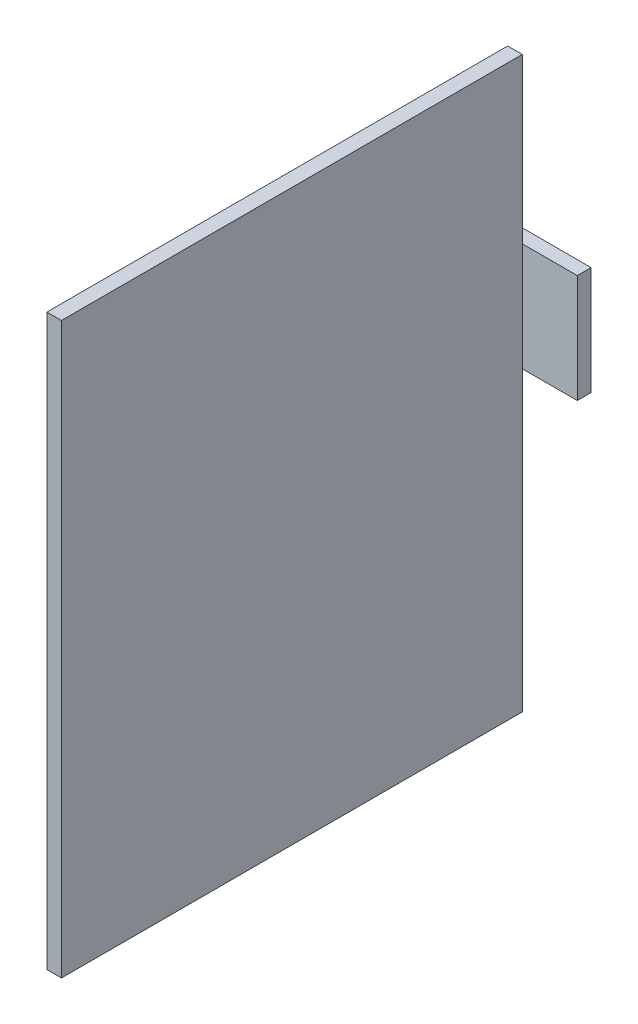
ISO-10303-21;
HEADER;
FILE_DESCRIPTION(('STEP AP214'),'2;1');
FILE_NAME('part.step','',(''),(''),'','','');
FILE_SCHEMA(('AUTOMOTIVE_DESIGN { 1 0 10303 214 1 1 1 1 }'));
ENDSEC;
DATA;
#1=APPLICATION_CONTEXT('core data for automotive mechanical design processes');
#2=APPLICATION_PROTOCOL_DEFINITION('international standard','automotive_design',2000,#1);
#3=PRODUCT_CONTEXT('',#1,'mechanical');
#4=PRODUCT('Part','Part','',(#3));
#5=PRODUCT_RELATED_PRODUCT_CATEGORY('part','',(#4));
#6=PRODUCT_DEFINITION_FORMATION('','',#4);
#7=PRODUCT_DEFINITION_CONTEXT('part definition',#1,'design');
#8=PRODUCT_DEFINITION('design','',#6,#7);
#9=PRODUCT_DEFINITION_SHAPE('','',#8);
#10=(LENGTH_UNIT() NAMED_UNIT(*) SI_UNIT(.MILLI.,.METRE.));
#11=(NAMED_UNIT(*) PLANE_ANGLE_UNIT() SI_UNIT($,.RADIAN.));
#12=(NAMED_UNIT(*) SI_UNIT($,.STERADIAN.) SOLID_ANGLE_UNIT());
#13=UNCERTAINTY_MEASURE_WITH_UNIT(LENGTH_MEASURE(1.E-05),#10,'distance_accuracy_value','');
#14=(GEOMETRIC_REPRESENTATION_CONTEXT(3) GLOBAL_UNCERTAINTY_ASSIGNED_CONTEXT((#13)) GLOBAL_UNIT_ASSIGNED_CONTEXT((#10,
#11,#12)) REPRESENTATION_CONTEXT('',''));
#15=CARTESIAN_POINT('',(0.,0.,0.));
#16=DIRECTION('',(0.,0.,1.));
#17=DIRECTION('',(1.,0.,0.));
#18=AXIS2_PLACEMENT_3D('',#15,#16,#17);
#19=CARTESIAN_POINT('',(0.,0.,3.));
#20=DIRECTION('',(0.,0.,1.));
#21=DIRECTION('',(1.,0.,0.));
#22=AXIS2_PLACEMENT_3D('',#19,#20,#21);
#23=PLANE('',#22);
#24=DIRECTION('',(0.,1.,0.));
#25=VECTOR('',#24,1.);
#26=CARTESIAN_POINT('',(-21.822491273943,47.7619782726975,3.));
#27=LINE('',#26,#25);
#28=CARTESIAN_POINT('',(-21.822491273943,-11.320502397344,3.));
#29=VERTEX_POINT('',#28);
#30=CARTESIAN_POINT('',(-21.822491273943,12.1690218367093,3.));
#31=VERTEX_POINT('',#30);
#32=EDGE_CURVE('E189',#29,#31,#27,.T.);
#33=ORIENTED_EDGE('',*,*,#32,.F.);
#34=DIRECTION('',(1.,0.,0.));
#35=VECTOR('',#34,1.);
#36=CARTESIAN_POINT('',(-33.5890871212518,-11.320502397344,3.));
#37=LINE('',#36,#35);
#38=CARTESIAN_POINT('',(-9.88669555588512,-11.320502397344,3.));
#39=VERTEX_POINT('',#38);
#40=EDGE_CURVE('E163',#29,#39,#37,.T.);
#41=ORIENTED_EDGE('',*,*,#40,.T.);
#42=DIRECTION('',(0.,1.,0.));
#43=VECTOR('',#42,1.);
#44=CARTESIAN_POINT('',(-9.88669555588512,12.1690218367093,3.));
#45=LINE('',#44,#43);
#46=CARTESIAN_POINT('',(-9.88669555588512,12.1690218367093,3.));
#47=VERTEX_POINT('',#46);
#48=EDGE_CURVE('E167',#39,#47,#45,.T.);
#49=ORIENTED_EDGE('',*,*,#48,.T.);
#50=DIRECTION('',(-1.,0.,0.));
#51=VECTOR('',#50,1.);
#52=CARTESIAN_POINT('',(-33.5890871212518,12.1690218367093,3.));
#53=LINE('',#52,#51);
#54=EDGE_CURVE('E170',#47,#31,#53,.T.);
#55=ORIENTED_EDGE('',*,*,#54,.T.);
#56=EDGE_LOOP('',(#33,#41,#49,#55));
#57=FACE_BOUND('',#56,.T.);
#58=ADVANCED_FACE('F43',(#57),#23,.T.);
#59=CARTESIAN_POINT('',(-33.5890871212518,12.1690218367093,3.));
#60=DIRECTION('',(1.,0.,0.));
#61=DIRECTION('',(0.,0.,-1.));
#62=AXIS2_PLACEMENT_3D('',#59,#60,#61);
#63=PLANE('',#62);
#64=DIRECTION('',(0.,-1.,0.));
#65=VECTOR('',#64,1.);
#66=CARTESIAN_POINT('',(-33.5890871212518,12.1690218367093,0.));
#67=LINE('',#66,#65);
#68=CARTESIAN_POINT('',(-33.5890871212518,12.1690218367093,0.));
#69=VERTEX_POINT('',#68);
#70=CARTESIAN_POINT('',(-33.5890871212518,-11.320502397344,0.));
#71=VERTEX_POINT('',#70);
#72=EDGE_CURVE('E152',#69,#71,#67,.T.);
#73=ORIENTED_EDGE('',*,*,#72,.T.);
#74=DIRECTION('',(0.,0.,-1.));
#75=VECTOR('',#74,1.);
#76=CARTESIAN_POINT('',(-33.5890871212518,-11.320502397344,3.));
#77=LINE('',#76,#75);
#78=CARTESIAN_POINT('',(-33.5890871212518,-11.320502397344,3.));
#79=VERTEX_POINT('',#78);
#80=EDGE_CURVE('E186',#79,#71,#77,.T.);
#81=ORIENTED_EDGE('',*,*,#80,.F.);
#82=DIRECTION('',(0.,-1.,0.));
#83=VECTOR('',#82,1.);
#84=CARTESIAN_POINT('',(-33.5890871212518,12.1690218367093,3.));
#85=LINE('',#84,#83);
#86=CARTESIAN_POINT('',(-33.5890871212518,12.1690218367093,3.));
#87=VERTEX_POINT('',#86);
#88=EDGE_CURVE('E161',#87,#79,#85,.T.);
#89=ORIENTED_EDGE('',*,*,#88,.F.);
#90=DIRECTION('',(0.,0.,-1.));
#91=VECTOR('',#90,1.);
#92=CARTESIAN_POINT('',(-33.5890871212518,12.1690218367093,3.));
#93=LINE('',#92,#91);
#94=EDGE_CURVE('E172',#87,#69,#93,.T.);
#95=ORIENTED_EDGE('',*,*,#94,.T.);
#96=EDGE_LOOP('',(#73,#81,#89,#95));
#97=FACE_BOUND('',#96,.T.);
#98=ADVANCED_FACE('F201',(#97),#63,.F.);
#99=CARTESIAN_POINT('',(-33.5890871212518,-11.320502397344,3.));
#100=DIRECTION('',(0.,1.,0.));
#101=DIRECTION('',(0.,0.,1.));
#102=AXIS2_PLACEMENT_3D('',#99,#100,#101);
#103=PLANE('',#102);
#104=DIRECTION('',(1.,0.,0.));
#105=VECTOR('',#104,1.);
#106=CARTESIAN_POINT('',(-33.5890871212518,-11.320502397344,0.));
#107=LINE('',#106,#105);
#108=CARTESIAN_POINT('',(-9.88669555588512,-11.320502397344,0.));
#109=VERTEX_POINT('',#108);
#110=EDGE_CURVE('E155',#71,#109,#107,.T.);
#111=ORIENTED_EDGE('',*,*,#110,.T.);
#112=DIRECTION('',(0.,0.,-1.));
#113=VECTOR('',#112,1.);
#114=CARTESIAN_POINT('',(-9.88669555588512,-11.320502397344,3.));
#115=LINE('',#114,#113);
#116=EDGE_CURVE('E183',#39,#109,#115,.T.);
#117=ORIENTED_EDGE('',*,*,#116,.F.);
#118=ORIENTED_EDGE('',*,*,#40,.F.);
#119=CARTESIAN_POINT('',(-24.9880001857896,-11.320502397344,3.));
#120=VERTEX_POINT('',#119);
#121=EDGE_CURVE('E166',#120,#29,#37,.T.);
#122=ORIENTED_EDGE('',*,*,#121,.F.);
#123=DIRECTION('',(0.,0.,-1.));
#124=VECTOR('',#123,1.);
#125=CARTESIAN_POINT('',(-24.9880001857896,-11.320502397344,3.));
#126=LINE('',#125,#124);
#127=CARTESIAN_POINT('',(-24.9880001857896,-11.320502397344,24.0258536011348));
#128=VERTEX_POINT('',#127);
#129=EDGE_CURVE('E194',#128,#120,#126,.T.);
#130=ORIENTED_EDGE('',*,*,#129,.F.);
#131=CARTESIAN_POINT('',(-54.9880001857896,-11.320502397344,24.0258536011348));
#132=DIRECTION('',(0.,1.,0.));
#133=DIRECTION('',(0.,0.,1.));
#134=AXIS2_PLACEMENT_3D('',#131,#132,#133);
#135=CIRCLE('',#134,30.);
#136=EDGE_CURVE('E51',#128,#79,#135,.T.);
#137=ORIENTED_EDGE('',*,*,#136,.T.);
#138=ORIENTED_EDGE('',*,*,#80,.T.);
#139=EDGE_LOOP('',(#111,#117,#118,#122,#130,#137,#138));
#140=FACE_BOUND('',#139,.T.);
#141=ADVANCED_FACE('F197',(#140),#103,.F.);
#142=CARTESIAN_POINT('',(-9.88669555588512,12.1690218367093,3.));
#143=DIRECTION('',(-1.,0.,0.));
#144=DIRECTION('',(0.,0.,1.));
#145=AXIS2_PLACEMENT_3D('',#142,#143,#144);
#146=PLANE('',#145);
#147=DIRECTION('',(0.,1.,0.));
#148=VECTOR('',#147,1.);
#149=CARTESIAN_POINT('',(-9.88669555588512,12.1690218367093,0.));
#150=LINE('',#149,#148);
#151=CARTESIAN_POINT('',(-9.88669555588512,12.1690218367093,0.));
#152=VERTEX_POINT('',#151);
#153=EDGE_CURVE('E175',#109,#152,#150,.T.);
#154=ORIENTED_EDGE('',*,*,#153,.T.);
#155=DIRECTION('',(0.,0.,-1.));
#156=VECTOR('',#155,1.);
#157=CARTESIAN_POINT('',(-9.88669555588512,12.1690218367093,3.));
#158=LINE('',#157,#156);
#159=EDGE_CURVE('E180',#47,#152,#158,.T.);
#160=ORIENTED_EDGE('',*,*,#159,.F.);
#161=ORIENTED_EDGE('',*,*,#48,.F.);
#162=ORIENTED_EDGE('',*,*,#116,.T.);
#163=EDGE_LOOP('',(#154,#160,#161,#162));
#164=FACE_BOUND('',#163,.T.);
#165=ADVANCED_FACE('F221',(#164),#146,.F.);
#166=CARTESIAN_POINT('',(-33.5890871212518,12.1690218367093,3.));
#167=DIRECTION('',(0.,-1.,0.));
#168=DIRECTION('',(0.,0.,-1.));
#169=AXIS2_PLACEMENT_3D('',#166,#167,#168);
#170=PLANE('',#169);
#171=DIRECTION('',(-1.,0.,0.));
#172=VECTOR('',#171,1.);
#173=CARTESIAN_POINT('',(-33.5890871212518,12.1690218367093,0.));
#174=LINE('',#173,#172);
#175=EDGE_CURVE('E164',#152,#69,#174,.T.);
#176=ORIENTED_EDGE('',*,*,#175,.T.);
#177=ORIENTED_EDGE('',*,*,#94,.F.);
#178=CARTESIAN_POINT('',(-54.9880001857896,12.1690218367093,24.0258536011348));
#179=DIRECTION('',(0.,-1.,0.));
#180=DIRECTION('',(0.,0.,-1.));
#181=AXIS2_PLACEMENT_3D('',#178,#179,#180);
#182=CIRCLE('',#181,30.);
#183=CARTESIAN_POINT('',(-24.9880001857896,12.1690218367093,24.0258536011348));
#184=VERTEX_POINT('',#183);
#185=EDGE_CURVE('E11',#87,#184,#182,.T.);
#186=ORIENTED_EDGE('',*,*,#185,.T.);
#187=DIRECTION('',(0.,0.,1.));
#188=VECTOR('',#187,1.);
#189=CARTESIAN_POINT('',(-24.9880001857896,12.1690218367093,3.));
#190=LINE('',#189,#188);
#191=CARTESIAN_POINT('',(-24.9880001857896,12.1690218367093,3.));
#192=VERTEX_POINT('',#191);
#193=EDGE_CURVE('E57',#192,#184,#190,.T.);
#194=ORIENTED_EDGE('',*,*,#193,.F.);
#195=EDGE_CURVE('E169',#31,#192,#53,.T.);
#196=ORIENTED_EDGE('',*,*,#195,.F.);
#197=ORIENTED_EDGE('',*,*,#54,.F.);
#198=ORIENTED_EDGE('',*,*,#159,.T.);
#199=EDGE_LOOP('',(#176,#177,#186,#194,#196,#197,#198));
#200=FACE_BOUND('',#199,.T.);
#201=ADVANCED_FACE('F204',(#200),#170,.F.);
#202=CARTESIAN_POINT('',(0.,0.,0.));
#203=DIRECTION('',(0.,0.,1.));
#204=DIRECTION('',(1.,0.,0.));
#205=AXIS2_PLACEMENT_3D('',#202,#203,#204);
#206=PLANE('',#205);
#207=ORIENTED_EDGE('',*,*,#72,.F.);
#208=ORIENTED_EDGE('',*,*,#175,.F.);
#209=ORIENTED_EDGE('',*,*,#153,.F.);
#210=ORIENTED_EDGE('',*,*,#110,.F.);
#211=EDGE_LOOP('',(#207,#208,#209,#210));
#212=FACE_BOUND('',#211,.T.);
#213=ADVANCED_FACE('F225',(#212),#206,.F.);
#214=CARTESIAN_POINT('',(0.,0.,3.));
#215=DIRECTION('',(0.,0.,-1.));
#216=DIRECTION('',(-1.,0.,0.));
#217=AXIS2_PLACEMENT_3D('',#214,#215,#216);
#218=PLANE('',#217);
#219=DIRECTION('',(0.,-1.,0.));
#220=VECTOR('',#219,1.);
#221=CARTESIAN_POINT('',(-24.9880001857896,47.7619782726975,3.));
#222=LINE('',#221,#220);
#223=CARTESIAN_POINT('',(-24.9880001857896,-75.8060197025742,3.));
#224=VERTEX_POINT('',#223);
#225=EDGE_CURVE('E211',#120,#224,#222,.T.);
#226=ORIENTED_EDGE('',*,*,#225,.F.);
#227=ORIENTED_EDGE('',*,*,#121,.T.);
#228=CARTESIAN_POINT('',(-21.822491273943,-75.8060197025742,3.));
#229=VERTEX_POINT('',#228);
#230=EDGE_CURVE('E232',#229,#29,#27,.T.);
#231=ORIENTED_EDGE('',*,*,#230,.F.);
#232=DIRECTION('',(1.,0.,0.));
#233=VECTOR('',#232,1.);
#234=CARTESIAN_POINT('',(-21.822491273943,-75.8060197025742,3.));
#235=LINE('',#234,#233);
#236=EDGE_CURVE('E144',#224,#229,#235,.T.);
#237=ORIENTED_EDGE('',*,*,#236,.F.);
#238=EDGE_LOOP('',(#226,#227,#231,#237));
#239=FACE_BOUND('',#238,.T.);
#240=ADVANCED_FACE('F230',(#239),#218,.T.);
#241=CARTESIAN_POINT('',(-21.822491273943,47.7619782726975,103.));
#242=DIRECTION('',(-1.,0.,0.));
#243=DIRECTION('',(0.,0.,1.));
#244=AXIS2_PLACEMENT_3D('',#241,#242,#243);
#245=PLANE('',#244);
#246=ORIENTED_EDGE('',*,*,#230,.T.);
#247=ORIENTED_EDGE('',*,*,#32,.T.);
#248=CARTESIAN_POINT('',(-21.822491273943,47.7619782726975,3.));
#249=VERTEX_POINT('',#248);
#250=EDGE_CURVE('E150',#31,#249,#27,.T.);
#251=ORIENTED_EDGE('',*,*,#250,.T.);
#252=DIRECTION('',(0.,0.,-1.));
#253=VECTOR('',#252,1.);
#254=CARTESIAN_POINT('',(-21.822491273943,47.7619782726975,103.));
#255=LINE('',#254,#253);
#256=CARTESIAN_POINT('',(-21.822491273943,47.7619782726975,103.));
#257=VERTEX_POINT('',#256);
#258=EDGE_CURVE('E129',#257,#249,#255,.T.);
#259=ORIENTED_EDGE('',*,*,#258,.F.);
#260=DIRECTION('',(0.,1.,0.));
#261=VECTOR('',#260,1.);
#262=CARTESIAN_POINT('',(-21.822491273943,47.7619782726975,103.));
#263=LINE('',#262,#261);
#264=CARTESIAN_POINT('',(-21.822491273943,-75.8060197025742,103.));
#265=VERTEX_POINT('',#264);
#266=EDGE_CURVE('E135',#265,#257,#263,.T.);
#267=ORIENTED_EDGE('',*,*,#266,.F.);
#268=DIRECTION('',(0.,0.,-1.));
#269=VECTOR('',#268,1.);
#270=CARTESIAN_POINT('',(-21.822491273943,-75.8060197025742,103.));
#271=LINE('',#270,#269);
#272=EDGE_CURVE('E233',#265,#229,#271,.T.);
#273=ORIENTED_EDGE('',*,*,#272,.T.);
#274=EDGE_LOOP('',(#246,#247,#251,#259,#267,#273));
#275=FACE_BOUND('',#274,.T.);
#276=ADVANCED_FACE('F147',(#275),#245,.F.);
#277=CARTESIAN_POINT('',(-21.822491273943,47.7619782726975,103.));
#278=DIRECTION('',(0.,-1.,0.));
#279=DIRECTION('',(0.,0.,-1.));
#280=AXIS2_PLACEMENT_3D('',#277,#278,#279);
#281=PLANE('',#280);
#282=DIRECTION('',(-1.,0.,0.));
#283=VECTOR('',#282,1.);
#284=CARTESIAN_POINT('',(-21.822491273943,47.7619782726975,3.));
#285=LINE('',#284,#283);
#286=CARTESIAN_POINT('',(-24.9880001857896,47.7619782726975,3.));
#287=VERTEX_POINT('',#286);
#288=EDGE_CURVE('E234',#249,#287,#285,.T.);
#289=ORIENTED_EDGE('',*,*,#288,.T.);
#290=DIRECTION('',(0.,0.,-1.));
#291=VECTOR('',#290,1.);
#292=CARTESIAN_POINT('',(-24.9880001857896,47.7619782726975,103.));
#293=LINE('',#292,#291);
#294=CARTESIAN_POINT('',(-24.9880001857896,47.7619782726975,103.));
#295=VERTEX_POINT('',#294);
#296=EDGE_CURVE('E131',#295,#287,#293,.T.);
#297=ORIENTED_EDGE('',*,*,#296,.F.);
#298=DIRECTION('',(-1.,0.,0.));
#299=VECTOR('',#298,1.);
#300=CARTESIAN_POINT('',(-21.822491273943,47.7619782726975,103.));
#301=LINE('',#300,#299);
#302=EDGE_CURVE('E125',#257,#295,#301,.T.);
#303=ORIENTED_EDGE('',*,*,#302,.F.);
#304=ORIENTED_EDGE('',*,*,#258,.T.);
#305=EDGE_LOOP('',(#289,#297,#303,#304));
#306=FACE_BOUND('',#305,.T.);
#307=ADVANCED_FACE('F127',(#306),#281,.F.);
#308=CARTESIAN_POINT('',(-24.9880001857896,47.7619782726975,103.));
#309=DIRECTION('',(1.,0.,0.));
#310=DIRECTION('',(0.,0.,-1.));
#311=AXIS2_PLACEMENT_3D('',#308,#309,#310);
#312=PLANE('',#311);
#313=DIRECTION('',(0.,1.,0.));
#314=VECTOR('',#313,1.);
#315=CARTESIAN_POINT('',(-24.9880001857896,47.7619782726975,24.0258536011348));
#316=LINE('',#315,#314);
#317=EDGE_CURVE('E191',#184,#128,#316,.F.);
#318=ORIENTED_EDGE('',*,*,#317,.T.);
#319=ORIENTED_EDGE('',*,*,#129,.T.);
#320=ORIENTED_EDGE('',*,*,#225,.T.);
#321=DIRECTION('',(0.,0.,-1.));
#322=VECTOR('',#321,1.);
#323=CARTESIAN_POINT('',(-24.9880001857896,-75.8060197025742,103.));
#324=LINE('',#323,#322);
#325=CARTESIAN_POINT('',(-24.9880001857896,-75.8060197025742,103.));
#326=VERTEX_POINT('',#325);
#327=EDGE_CURVE('E157',#326,#224,#324,.T.);
#328=ORIENTED_EDGE('',*,*,#327,.F.);
#329=DIRECTION('',(0.,-1.,0.));
#330=VECTOR('',#329,1.);
#331=CARTESIAN_POINT('',(-24.9880001857896,47.7619782726975,103.));
#332=LINE('',#331,#330);
#333=EDGE_CURVE('E134',#295,#326,#332,.T.);
#334=ORIENTED_EDGE('',*,*,#333,.F.);
#335=ORIENTED_EDGE('',*,*,#296,.T.);
#336=EDGE_CURVE('E208',#287,#192,#222,.T.);
#337=ORIENTED_EDGE('',*,*,#336,.T.);
#338=ORIENTED_EDGE('',*,*,#193,.T.);
#339=EDGE_LOOP('',(#318,#319,#320,#328,#334,#335,#337,#338));
#340=FACE_BOUND('',#339,.T.);
#341=ADVANCED_FACE('F206',(#340),#312,.F.);
#342=CARTESIAN_POINT('',(-21.822491273943,-75.8060197025742,103.));
#343=DIRECTION('',(0.,1.,0.));
#344=DIRECTION('',(0.,0.,1.));
#345=AXIS2_PLACEMENT_3D('',#342,#343,#344);
#346=PLANE('',#345);
#347=ORIENTED_EDGE('',*,*,#236,.T.);
#348=ORIENTED_EDGE('',*,*,#272,.F.);
#349=DIRECTION('',(1.,0.,0.));
#350=VECTOR('',#349,1.);
#351=CARTESIAN_POINT('',(-21.822491273943,-75.8060197025742,103.));
#352=LINE('',#351,#350);
#353=EDGE_CURVE('E140',#326,#265,#352,.T.);
#354=ORIENTED_EDGE('',*,*,#353,.F.);
#355=ORIENTED_EDGE('',*,*,#327,.T.);
#356=EDGE_LOOP('',(#347,#348,#354,#355));
#357=FACE_BOUND('',#356,.T.);
#358=ADVANCED_FACE('F244',(#357),#346,.F.);
#359=CARTESIAN_POINT('',(0.,0.,103.));
#360=DIRECTION('',(0.,0.,-1.));
#361=DIRECTION('',(-1.,0.,0.));
#362=AXIS2_PLACEMENT_3D('',#359,#360,#361);
#363=PLANE('',#362);
#364=ORIENTED_EDGE('',*,*,#266,.T.);
#365=ORIENTED_EDGE('',*,*,#302,.T.);
#366=ORIENTED_EDGE('',*,*,#333,.T.);
#367=ORIENTED_EDGE('',*,*,#353,.T.);
#368=EDGE_LOOP('',(#364,#365,#366,#367));
#369=FACE_BOUND('',#368,.T.);
#370=ADVANCED_FACE('F138',(#369),#363,.F.);
#371=ORIENTED_EDGE('',*,*,#250,.F.);
#372=ORIENTED_EDGE('',*,*,#195,.T.);
#373=ORIENTED_EDGE('',*,*,#336,.F.);
#374=ORIENTED_EDGE('',*,*,#288,.F.);
#375=EDGE_LOOP('',(#371,#372,#373,#374));
#376=FACE_BOUND('',#375,.T.);
#377=ADVANCED_FACE('F213',(#376),#218,.T.);
#378=CARTESIAN_POINT('',(-54.9880001857896,0.,24.0258536011348));
#379=DIRECTION('',(0.,1.,0.));
#380=DIRECTION('',(0.,0.,1.));
#381=AXIS2_PLACEMENT_3D('',#378,#379,#380);
#382=CYLINDRICAL_SURFACE('',#381,30.);
#383=ORIENTED_EDGE('',*,*,#185,.F.);
#384=ORIENTED_EDGE('',*,*,#88,.T.);
#385=ORIENTED_EDGE('',*,*,#136,.F.);
#386=ORIENTED_EDGE('',*,*,#317,.F.);
#387=EDGE_LOOP('',(#383,#384,#385,#386));
#388=FACE_BOUND('',#387,.T.);
#389=ADVANCED_FACE('F45',(#388),#382,.F.);
#390=CLOSED_SHELL('',(#58,#98,#141,#165,#201,#213,#240,#276,#307,#341,#358,#370,#377,#389));
#391=MANIFOLD_SOLID_BREP('B2',#390);
#392=ADVANCED_BREP_SHAPE_REPRESENTATION('',(#18,#391),#14);
#393=SHAPE_DEFINITION_REPRESENTATION(#9,#392);
ENDSEC;
END-ISO-10303-21;
